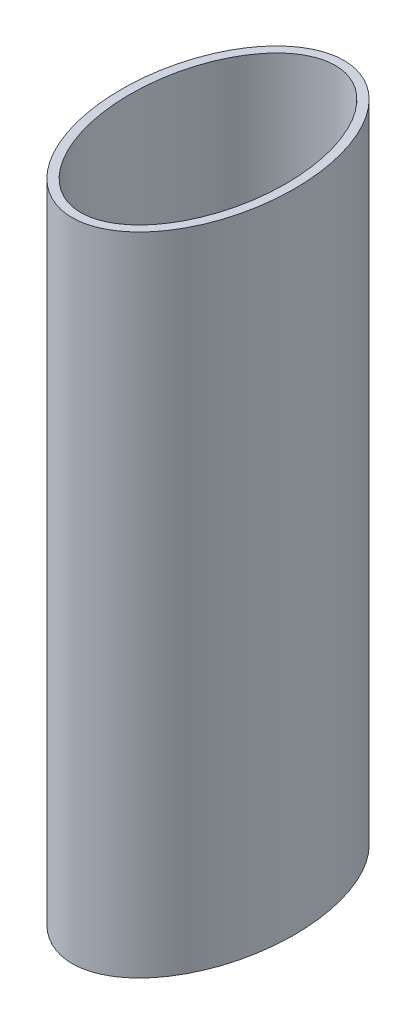
ISO-10303-21;
HEADER;
FILE_DESCRIPTION(('STEP AP214'),'2;1');
FILE_NAME('part.step','',(''),(''),'','','');
FILE_SCHEMA(('AUTOMOTIVE_DESIGN { 1 0 10303 214 1 1 1 1 }'));
ENDSEC;
DATA;
#1=APPLICATION_CONTEXT('core data for automotive mechanical design processes');
#2=APPLICATION_PROTOCOL_DEFINITION('international standard','automotive_design',2000,#1);
#3=PRODUCT_CONTEXT('',#1,'mechanical');
#4=PRODUCT('Part','Part','',(#3));
#5=PRODUCT_RELATED_PRODUCT_CATEGORY('part','',(#4));
#6=PRODUCT_DEFINITION_FORMATION('','',#4);
#7=PRODUCT_DEFINITION_CONTEXT('part definition',#1,'design');
#8=PRODUCT_DEFINITION('design','',#6,#7);
#9=PRODUCT_DEFINITION_SHAPE('','',#8);
#10=(LENGTH_UNIT() NAMED_UNIT(*) SI_UNIT(.MILLI.,.METRE.));
#11=(NAMED_UNIT(*) PLANE_ANGLE_UNIT() SI_UNIT($,.RADIAN.));
#12=(NAMED_UNIT(*) SI_UNIT($,.STERADIAN.) SOLID_ANGLE_UNIT());
#13=UNCERTAINTY_MEASURE_WITH_UNIT(LENGTH_MEASURE(1.E-05),#10,'distance_accuracy_value','');
#14=(GEOMETRIC_REPRESENTATION_CONTEXT(3) GLOBAL_UNCERTAINTY_ASSIGNED_CONTEXT((#13)) GLOBAL_UNIT_ASSIGNED_CONTEXT((#10,
#11,#12)) REPRESENTATION_CONTEXT('',''));
#15=CARTESIAN_POINT('',(0.,0.,0.));
#16=DIRECTION('',(0.,0.,1.));
#17=DIRECTION('',(1.,0.,0.));
#18=AXIS2_PLACEMENT_3D('',#15,#16,#17);
#19=CARTESIAN_POINT('',(0.,190.,0.));
#20=DIRECTION('',(0.,1.,0.));
#21=DIRECTION('',(0.,0.,-1.));
#22=AXIS2_PLACEMENT_3D('',#19,#20,#21);
#23=ELLIPSE('',#22,40.005,25.4);
#24=DIRECTION('',(0.,-1.,0.));
#25=VECTOR('',#24,1.);
#26=SURFACE_OF_LINEAR_EXTRUSION('',#23,#25);
#27=CARTESIAN_POINT('',(0.,190.,-40.005));
#28=VERTEX_POINT('',#27);
#29=EDGE_CURVE('E10',#28,#28,#23,.T.);
#30=ORIENTED_EDGE('',*,*,#29,.F.);
#31=EDGE_LOOP('',(#30));
#32=FACE_BOUND('',#31,.T.);
#33=CARTESIAN_POINT('',(0.,0.,0.));
#34=DIRECTION('',(0.,1.,0.));
#35=DIRECTION('',(0.,0.,-1.));
#36=AXIS2_PLACEMENT_3D('',#33,#34,#35);
#37=ELLIPSE('',#36,40.005,25.4);
#38=CARTESIAN_POINT('',(0.,0.,-40.005));
#39=VERTEX_POINT('',#38);
#40=EDGE_CURVE('E45',#39,#39,#37,.T.);
#41=ORIENTED_EDGE('',*,*,#40,.T.);
#42=EDGE_LOOP('',(#41));
#43=FACE_BOUND('',#42,.T.);
#44=ADVANCED_FACE('F41',(#32,#43),#26,.F.);
#45=CARTESIAN_POINT('',(0.,190.,0.));
#46=DIRECTION('',(0.,1.,0.));
#47=DIRECTION('',(0.,0.,1.));
#48=AXIS2_PLACEMENT_3D('',#45,#46,#47);
#49=PLANE('',#48);
#50=CARTESIAN_POINT('',(0.,190.,37.465));
#51=CARTESIAN_POINT('',(0.414448423922946,190.,37.465004374444));
#52=CARTESIAN_POINT('',(0.828866331709746,190.,37.4459979145985));
#53=CARTESIAN_POINT('',(1.65441120322675,190.,37.3704664108997));
#54=CARTESIAN_POINT('',(2.06553696197769,190.,37.313928212918));
#55=CARTESIAN_POINT('',(2.881701454367,190.,37.1646315351249));
#56=CARTESIAN_POINT('',(3.28673103265663,190.,37.0718233173257));
#57=CARTESIAN_POINT('',(4.08737543968349,190.,36.8521521220896));
#58=CARTESIAN_POINT('',(4.4829907663271,190.,36.7252909500424));
#59=CARTESIAN_POINT('',(5.25963497488405,190.,36.4412513746079));
#60=CARTESIAN_POINT('',(5.64075341664919,190.,36.2843166071428));
#61=CARTESIAN_POINT('',(6.39007899207038,190.,35.9422960226937));
#62=CARTESIAN_POINT('',(6.7582862646886,190.,35.757210508809));
#63=CARTESIAN_POINT('',(7.48076319999814,190.,35.3616960365381));
#64=CARTESIAN_POINT('',(7.83503337049581,190.,35.151268002658));
#65=CARTESIAN_POINT('',(8.52911210488282,190.,34.707720352644));
#66=CARTESIAN_POINT('',(8.86891701747657,190.,34.4745950555488));
#67=CARTESIAN_POINT('',(9.74497237099162,190.,33.8336177084517));
#68=CARTESIAN_POINT('',(10.26890538211,190.,33.4088380573749));
#69=CARTESIAN_POINT('',(11.2774377166251,190.,32.5148587871108));
#70=CARTESIAN_POINT('',(11.7620161880654,190.,32.0456359012782));
#71=CARTESIAN_POINT('',(12.6939424221609,190.,31.0696024160194));
#72=CARTESIAN_POINT('',(13.1411992344611,190.,30.5627053766742));
#73=CARTESIAN_POINT('',(13.998788022835,190.,29.5187800009299));
#74=CARTESIAN_POINT('',(14.4091214563378,190.,28.9817528551776));
#75=CARTESIAN_POINT('',(15.2121337585992,190.,27.8583142166302));
#76=CARTESIAN_POINT('',(15.603220546596,190.,27.2707687546045));
#77=CARTESIAN_POINT('',(16.3493031227568,190.,26.0728966004249));
#78=CARTESIAN_POINT('',(16.7042813078605,190.,25.4625589933579));
#79=CARTESIAN_POINT('',(17.3798794874783,190.,24.2230963435948));
#80=CARTESIAN_POINT('',(17.7004941240504,190.,23.5939683906172));
#81=CARTESIAN_POINT('',(18.3093794098373,190.,22.3193740940405));
#82=CARTESIAN_POINT('',(18.5976107371562,190.,21.6738890290808));
#83=CARTESIAN_POINT('',(19.1427540602479,190.,20.3700269705304));
#84=CARTESIAN_POINT('',(19.3996729942574,190.,19.71165287057));
#85=CARTESIAN_POINT('',(19.8836101430196,190.,18.3839894586006));
#86=CARTESIAN_POINT('',(20.1106256930594,190.,17.7146991798068));
#87=CARTESIAN_POINT('',(20.6364124435819,190.,16.0485512847703));
#88=CARTESIAN_POINT('',(20.9183952065905,190.,15.0463634268187));
#89=CARTESIAN_POINT('',(21.423099473597,190.,13.026894998963));
#90=CARTESIAN_POINT('',(21.6457980291103,190.,12.0096087449811));
#91=CARTESIAN_POINT('',(22.0341449624228,190.,9.96405647004885));
#92=CARTESIAN_POINT('',(22.1997834997028,190.,8.93578858671065));
#93=CARTESIAN_POINT('',(22.4758567387561,190.,6.87011313821167));
#94=CARTESIAN_POINT('',(22.5861964837205,190.,5.83269294350333));
#95=CARTESIAN_POINT('',(22.7523221007236,190.,3.7537238199755));
#96=CARTESIAN_POINT('',(22.8081191141986,190.,2.71217577801398));
#97=CARTESIAN_POINT('',(22.8657414016158,190.,0.627646505842776));
#98=CARTESIAN_POINT('',(22.8675692548732,190.,-0.415334653492289));
#99=CARTESIAN_POINT('',(22.8167077682517,190.,-2.52365950174605));
#100=CARTESIAN_POINT('',(22.7627805690017,190.,-3.58897366721971));
#101=CARTESIAN_POINT('',(22.5979474993928,190.,-5.71529343174462));
#102=CARTESIAN_POINT('',(22.4870367521909,190.,-6.77629865418738));
#103=CARTESIAN_POINT('',(22.207041302917,190.,-8.89099386651914));
#104=CARTESIAN_POINT('',(22.0379375729495,190.,-9.94468134854904));
#105=CARTESIAN_POINT('',(21.6403245953017,190.,-12.0378356156514));
#106=CARTESIAN_POINT('',(21.4119803637066,190.,-13.077333591044));
#107=CARTESIAN_POINT('',(20.8932742551138,190.,-15.1405014945456));
#108=CARTESIAN_POINT('',(20.6029294835669,190.,-16.1641757049377));
#109=CARTESIAN_POINT('',(19.9571379319012,190.,-18.1901922925111));
#110=CARTESIAN_POINT('',(19.601735165809,190.,-19.1925485833458));
#111=CARTESIAN_POINT('',(18.9047169430771,190.,-20.9593333117564));
#112=CARTESIAN_POINT('',(18.5762855149272,190.,-21.7289693466785));
#113=CARTESIAN_POINT('',(17.8740926402127,190.,-23.2472331064848));
#114=CARTESIAN_POINT('',(17.5003393078203,190.,-23.9958645624411));
#115=CARTESIAN_POINT('',(16.7048356421202,190.,-25.4668958748454));
#116=CARTESIAN_POINT('',(16.2831046715429,190.,-26.1893061594137));
#117=CARTESIAN_POINT('',(15.3884189590887,190.,-27.6017311264595));
#118=CARTESIAN_POINT('',(14.9154750760659,190.,-28.2917526321383));
#119=CARTESIAN_POINT('',(14.0293292182837,190.,-29.4780596331627));
#120=CARTESIAN_POINT('',(13.6271662296346,190.,-29.9825889155412));
#121=CARTESIAN_POINT('',(12.7887655147053,190.,-30.9626660726087));
#122=CARTESIAN_POINT('',(12.3525263860799,190.,-31.4382127531331));
#123=CARTESIAN_POINT('',(11.4451695888148,190.,-32.3538331184007));
#124=CARTESIAN_POINT('',(10.9741003948412,190.,-32.7939543876123));
#125=CARTESIAN_POINT('',(10.2406077927452,190.,-33.4223979506941));
#126=CARTESIAN_POINT('',(9.9916610970022,190.,-33.6265662291246));
#127=CARTESIAN_POINT('',(9.48465150510137,190.,-34.0234024132406));
#128=CARTESIAN_POINT('',(9.22658652109741,190.,-34.2160676575152));
#129=CARTESIAN_POINT('',(8.59470118777803,190.,-34.6644668848235));
#130=CARTESIAN_POINT('',(8.21645475536548,190.,-34.914016563098));
#131=CARTESIAN_POINT('',(7.44270136811752,190.,-35.3845764602448));
#132=CARTESIAN_POINT('',(7.04719948564054,190.,-35.6055949914187));
#133=CARTESIAN_POINT('',(6.2400428497783,190.,-36.0154249145427));
#134=CARTESIAN_POINT('',(5.82839684876282,190.,-36.2042534690006));
#135=CARTESIAN_POINT('',(4.99036329002692,190.,-36.5461173794692));
#136=CARTESIAN_POINT('',(4.56397556846282,190.,-36.6991523375129));
#137=CARTESIAN_POINT('',(3.84024272163277,190.,-36.9223180195639));
#138=CARTESIAN_POINT('',(3.54618094190691,190.,-37.0032074452688));
#139=CARTESIAN_POINT('',(2.95347737733211,190.,-37.1461823876781));
#140=CARTESIAN_POINT('',(2.65483541789965,190.,-37.2082671857222));
#141=CARTESIAN_POINT('',(2.05413851194401,190.,-37.3128234717382));
#142=CARTESIAN_POINT('',(1.75208364028681,190.,-37.3552953890878));
#143=CARTESIAN_POINT('',(1.14604035389511,190.,-37.4200325376793));
#144=CARTESIAN_POINT('',(0.842053574516957,190.,-37.4423130290124));
#145=CARTESIAN_POINT('',(0.233254642842897,190.,-37.4664088901139));
#146=CARTESIAN_POINT('',(-0.0715575345055395,190.,-37.4682236315798));
#147=CARTESIAN_POINT('',(-0.680544551616603,190.,-37.4513677093011));
#148=CARTESIAN_POINT('',(-0.984719495643383,190.,-37.4327007103388));
#149=CARTESIAN_POINT('',(-1.67754010086559,190.,-37.3669326336051));
#150=CARTESIAN_POINT('',(-2.06557620813854,190.,-37.3132486590673));
#151=CARTESIAN_POINT('',(-2.83570183524243,190.,-37.1736800879456));
#152=CARTESIAN_POINT('',(-3.21779216416761,190.,-37.0877999132033));
#153=CARTESIAN_POINT('',(-3.97397608615159,190.,-36.8855715959796));
#154=CARTESIAN_POINT('',(-4.34806610148783,190.,-36.7692101182534));
#155=CARTESIAN_POINT('',(-5.08624424501896,190.,-36.5082019411734));
#156=CARTESIAN_POINT('',(-5.45033073117671,190.,-36.3635506294247));
#157=CARTESIAN_POINT('',(-6.28679299401831,190.,-35.9956696633618));
#158=CARTESIAN_POINT('',(-6.75473854023137,190.,-35.7623292678933));
#159=CARTESIAN_POINT('',(-7.66815696156987,190.,-35.2552196202386));
#160=CARTESIAN_POINT('',(-8.11362314253201,190.,-34.9814384193356));
#161=CARTESIAN_POINT('',(-8.98164447252019,190.,-34.3984363191736));
#162=CARTESIAN_POINT('',(-9.40416240669964,190.,-34.0891602460765));
#163=CARTESIAN_POINT('',(-10.2252246475691,190.,-33.4404302384597));
#164=CARTESIAN_POINT('',(-10.6237679348968,190.,-33.1009750222912));
#165=CARTESIAN_POINT('',(-11.5851437934177,190.,-32.2248099065284));
#166=CARTESIAN_POINT('',(-12.1337068513157,190.,-31.6724001661057));
#167=CARTESIAN_POINT('',(-13.1805479747833,190.,-30.5218274840967));
#168=CARTESIAN_POINT('',(-13.6788017150159,190.,-29.9236426529349));
#169=CARTESIAN_POINT('',(-14.6281936981753,190.,-28.6897524957137));
#170=CARTESIAN_POINT('',(-15.0792610951173,190.,-28.0539929321682));
#171=CARTESIAN_POINT('',(-15.9361505210185,190.,-26.752882581985));
#172=CARTESIAN_POINT('',(-16.3419741467484,190.,-26.0875328408218));
#173=CARTESIAN_POINT('',(-17.1305947790013,190.,-24.6982902533005));
#174=CARTESIAN_POINT('',(-17.51117054293,190.,-23.9731410406937));
#175=CARTESIAN_POINT('',(-18.2281879311786,190.,-22.5010166283179));
#176=CARTESIAN_POINT('',(-18.5646083759209,190.,-21.7540311630724));
#177=CARTESIAN_POINT('',(-19.195553584587,190.,-20.2424960194583));
#178=CARTESIAN_POINT('',(-19.4900716260775,190.,-19.4779435456024));
#179=CARTESIAN_POINT('',(-20.0396244648011,190.,-17.9334901291138));
#180=CARTESIAN_POINT('',(-20.2945971559002,190.,-17.1535671691097));
#181=CARTESIAN_POINT('',(-20.7661914485948,190.,-15.5824313391415));
#182=CARTESIAN_POINT('',(-20.9828215168595,190.,-14.7912210034142));
#183=CARTESIAN_POINT('',(-21.3792382359049,190.,-13.1996094447536));
#184=CARTESIAN_POINT('',(-21.5590221500394,190.,-12.3992075438013));
#185=CARTESIAN_POINT('',(-21.93955567918,190.,-10.5099420003362));
#186=CARTESIAN_POINT('',(-22.1256440258697,190.,-9.4181031105704));
#187=CARTESIAN_POINT('',(-22.4349686373232,190.,-7.22531890450744));
#188=CARTESIAN_POINT('',(-22.5581864435934,190.,-6.12437101014905));
#189=CARTESIAN_POINT('',(-22.7430906870273,190.,-3.91710499474451));
#190=CARTESIAN_POINT('',(-22.8047644454852,190.,-2.81078581430999));
#191=CARTESIAN_POINT('',(-22.8672250316276,190.,-0.59604790914873));
#192=CARTESIAN_POINT('',(-22.8679903637401,190.,0.51237141874729));
#193=CARTESIAN_POINT('',(-22.8085960100405,190.,2.72733941959448));
#194=CARTESIAN_POINT('',(-22.7484493305794,190.,3.83388844138088));
#195=CARTESIAN_POINT('',(-22.5666058288344,190.,6.04171739847547));
#196=CARTESIAN_POINT('',(-22.4449231678048,190.,7.14299848725612));
#197=CARTESIAN_POINT('',(-22.1710624462369,190.,9.10464291258354));
#198=CARTESIAN_POINT('',(-22.03078294744,190.,9.9666820773358));
#199=CARTESIAN_POINT('',(-21.7101245268493,190.,11.6832613812042));
#200=CARTESIAN_POINT('',(-21.5297478669701,190.,12.5378019404976));
#201=CARTESIAN_POINT('',(-21.1275449208434,190.,14.2372962390312));
#202=CARTESIAN_POINT('',(-20.9057096733578,190.,15.0822478636698));
#203=CARTESIAN_POINT('',(-20.419497277319,190.,16.7578494880102));
#204=CARTESIAN_POINT('',(-20.1552150007549,190.,17.5885269118316));
#205=CARTESIAN_POINT('',(-19.5817924747554,190.,19.2341558256183));
#206=CARTESIAN_POINT('',(-19.2726596051827,190.,20.0491098778123));
#207=CARTESIAN_POINT('',(-18.6072268087233,190.,21.6591696601523));
#208=CARTESIAN_POINT('',(-18.250950075229,190.,22.4542849232396));
#209=CARTESIAN_POINT('',(-17.5322748965853,190.,23.9298096629541));
#210=CARTESIAN_POINT('',(-17.175325710012,190.,24.6128688971508));
#211=CARTESIAN_POINT('',(-16.4199101924136,190.,25.9557258119332));
#212=CARTESIAN_POINT('',(-16.021445149624,190.,26.6155242134518));
#213=CARTESIAN_POINT('',(-15.1807485315982,190.,27.9061727052102));
#214=CARTESIAN_POINT('',(-14.7385437798872,190.,28.5370401942085));
#215=CARTESIAN_POINT('',(-13.8075690405828,190.,29.7634662259556));
#216=CARTESIAN_POINT('',(-13.3188117014029,190.,30.3590342886759));
#217=CARTESIAN_POINT('',(-12.4242559283785,190.,31.3587220526105));
#218=CARTESIAN_POINT('',(-12.0294497636026,190.,31.7726863258237));
#219=CARTESIAN_POINT('',(-11.2118012466599,190.,32.5721154052383));
#220=CARTESIAN_POINT('',(-10.7889586634387,190.,32.9575799765119));
#221=CARTESIAN_POINT('',(-9.91516259481808,190.,33.6944396677837));
#222=CARTESIAN_POINT('',(-9.46423738586834,190.,34.045868175824));
#223=CARTESIAN_POINT('',(-8.53402900870969,190.,34.7089644783754));
#224=CARTESIAN_POINT('',(-8.05475530395452,190.,35.0206454332019));
#225=CARTESIAN_POINT('',(-7.19127878647486,190.,35.5258172411402));
#226=CARTESIAN_POINT('',(-6.81299460207545,190.,35.7294447722414));
#227=CARTESIAN_POINT('',(-6.04191360868823,190.,36.1072448072435));
#228=CARTESIAN_POINT('',(-5.64911705679518,190.,36.281417832643));
#229=CARTESIAN_POINT('',(-4.85137251879736,190.,36.5967864043364));
#230=CARTESIAN_POINT('',(-4.44645112131786,190.,36.7380488868676));
#231=CARTESIAN_POINT('',(-3.62603162455497,190.,36.9850139342775));
#232=CARTESIAN_POINT('',(-3.21053774247644,190.,37.0907304459479));
#233=CARTESIAN_POINT('',(-2.33239054037115,190.,37.2722420752423));
#234=CARTESIAN_POINT('',(-1.86895905296282,190.,37.3443171514177));
#235=CARTESIAN_POINT('',(-0.937006113473176,190.,37.4406989141707));
#236=CARTESIAN_POINT('',(-0.468483560657631,190.,37.4649950552228));
#237=CARTESIAN_POINT('',(0.,190.,37.465));
#238=B_SPLINE_CURVE_WITH_KNOTS('',3,(#50,#51,#52,#53,#54,#55,#56,#57,#58,#59,#60,#61,#62,#63,
#64,#65,#66,#67,#68,#69,#70,#71,#72,#73,#74,#75,#76,#77,#78,#79,#80,#81,#82,#83,#84,#85,#86,#87,
#88,#89,#90,#91,#92,#93,#94,#95,#96,#97,#98,#99,#100,#101,#102,#103,#104,#105,#106,#107,#108,
#109,#110,#111,#112,#113,#114,#115,#116,#117,#118,#119,#120,#121,#122,#123,#124,#125,#126,#127,
#128,#129,#130,#131,#132,#133,#134,#135,#136,#137,#138,#139,#140,#141,#142,#143,#144,#145,#146,
#147,#148,#149,#150,#151,#152,#153,#154,#155,#156,#157,#158,#159,#160,#161,#162,#163,#164,#165,
#166,#167,#168,#169,#170,#171,#172,#173,#174,#175,#176,#177,#178,#179,#180,#181,#182,#183,#184,
#185,#186,#187,#188,#189,#190,#191,#192,#193,#194,#195,#196,#197,#198,#199,#200,#201,#202,#203,
#204,#205,#206,#207,#208,#209,#210,#211,#212,#213,#214,#215,#216,#217,#218,#219,#220,#221,#222,
#223,#224,#225,#226,#227,#228,#229,#230,#231,#232,#233,#234,#235,#236,#237),.UNSPECIFIED.,.T.,
.F.,(4,2,2,2,2,2,2,2,2,2,2,2,2,2,2,2,2,2,2,2,2,2,2,2,2,2,2,2,2,2,2,2,2,2,2,2,2,2,2,2,2,2,2,2,2,
2,2,2,2,2,2,2,2,2,2,2,2,2,2,2,2,2,2,2,2,2,2,2,2,2,2,2,2,2,2,2,2,2,2,2,2,2,2,2,2,2,2,2,2,2,2,2,2,
4),(0.,1.24286321869788,2.48616226640074,3.73117229795968,4.97611633569838,6.21137127146488,
7.44661290817043,8.6818094963714,9.91731604407071,11.9375925556586,13.9589326179489,
15.9850628341165,18.0111130403286,20.1270937730055,22.244101158533,24.3614381477523,
26.4813189738299,28.6007292169376,30.7203281947017,33.8415912060727,36.9640606845087,
40.0870683919439,43.2154205811419,46.3431336086483,49.4706971550304,52.6692207198895,
55.8680180707236,59.0678623571735,62.2588873400565,65.4490330796033,68.6370284964655,
71.1460629655843,73.6546488930279,76.1622259775119,78.6692724088733,80.6035140729671,
82.537835379445,84.4695135140432,85.435114825965,86.4009386863051,87.7592182500463,
89.1171011934301,90.4742578839582,91.8314296631636,92.7458315802822,93.6602684388768,
94.5746852770849,95.488410447948,96.4021636702737,97.3157534220854,98.489480719552,
99.6630468757633,100.837127314612,102.0113993362,103.577728649209,105.144521681974,
106.713784020641,108.283113034657,110.614993656231,112.947996432773,115.28445319009,
117.620827461632,120.076042396943,122.532430732072,124.989212704089,127.449814822306,
129.909872920207,132.370113665957,135.69086924269,139.012599217387,142.335013361381,
145.658600034039,148.981477181244,152.303589983616,154.922847139415,157.541956578188,
160.161632791345,162.77553330896,165.389004213623,168.001194115008,170.311989969859,
172.622714142146,174.932029938603,177.240720070394,178.955654815907,180.67060369635,
182.383852868155,184.096533306492,185.384241463515,186.671926818992,187.956969850457,
189.24150809339,190.646103892453,192.05100967203),.UNSPECIFIED.);
#239=CARTESIAN_POINT('',(0.,190.,37.465));
#240=VERTEX_POINT('',#239);
#241=EDGE_CURVE('E53',#240,#240,#238,.T.);
#242=ORIENTED_EDGE('',*,*,#241,.F.);
#243=EDGE_LOOP('',(#242));
#244=FACE_BOUND('',#243,.T.);
#245=ORIENTED_EDGE('',*,*,#29,.T.);
#246=EDGE_LOOP('',(#245));
#247=FACE_BOUND('',#246,.T.);
#248=ADVANCED_FACE('F85',(#244,#247),#49,.T.);
#249=CARTESIAN_POINT('',(0.,0.,0.));
#250=DIRECTION('',(0.,1.,0.));
#251=DIRECTION('',(0.,0.,1.));
#252=AXIS2_PLACEMENT_3D('',#249,#250,#251);
#253=PLANE('',#252);
#254=ORIENTED_EDGE('',*,*,#40,.F.);
#255=EDGE_LOOP('',(#254));
#256=FACE_BOUND('',#255,.T.);
#257=ADVANCED_FACE('F78',(#256),#253,.F.);
#258=CARTESIAN_POINT('',(0.,190.,0.));
#259=DIRECTION('',(0.,1.,0.));
#260=DIRECTION('',(0.,0.,-1.));
#261=AXIS2_PLACEMENT_3D('',#258,#259,#260);
#262=ELLIPSE('',#261,40.005,25.4);
#263=DIRECTION('',(0.,-1.,0.));
#264=VECTOR('',#263,1.);
#265=SURFACE_OF_LINEAR_EXTRUSION('',#262,#264);
#266=OFFSET_SURFACE('',#265,2.54,.F.);
#267=ORIENTED_EDGE('',*,*,#241,.T.);
#268=EDGE_LOOP('',(#267));
#269=FACE_BOUND('',#268,.T.);
#270=CARTESIAN_POINT('',(0.,2.53999999999998,37.465));
#271=CARTESIAN_POINT('',(0.414448423922946,2.53999999999998,37.465004374444));
#272=CARTESIAN_POINT('',(0.828866331709746,2.54,37.4459979145985));
#273=CARTESIAN_POINT('',(1.65441120322675,2.54000000000001,37.3704664108997));
#274=CARTESIAN_POINT('',(2.06553696197769,2.54,37.313928212918));
#275=CARTESIAN_POINT('',(2.881701454367,2.54,37.1646315351249));
#276=CARTESIAN_POINT('',(3.28673103265663,2.54,37.0718233173257));
#277=CARTESIAN_POINT('',(4.08737543968349,2.54,36.8521521220896));
#278=CARTESIAN_POINT('',(4.4829907663271,2.53999999999999,36.7252909500424));
#279=CARTESIAN_POINT('',(5.25963497488405,2.53999999999999,36.4412513746079));
#280=CARTESIAN_POINT('',(5.64075341664919,2.54,36.2843166071428));
#281=CARTESIAN_POINT('',(6.39007899207038,2.54,35.9422960226937));
#282=CARTESIAN_POINT('',(6.7582862646886,2.54,35.757210508809));
#283=CARTESIAN_POINT('',(7.48076319999814,2.54,35.3616960365381));
#284=CARTESIAN_POINT('',(7.83503337049581,2.54,35.151268002658));
#285=CARTESIAN_POINT('',(8.52911210488282,2.54,34.707720352644));
#286=CARTESIAN_POINT('',(8.86891701747657,2.53999999999999,34.4745950555488));
#287=CARTESIAN_POINT('',(9.74497237099162,2.53999999999998,33.8336177084517));
#288=CARTESIAN_POINT('',(10.26890538211,2.54,33.4088380573749));
#289=CARTESIAN_POINT('',(11.2774377166251,2.54,32.5148587871108));
#290=CARTESIAN_POINT('',(11.7620161880654,2.54,32.0456359012782));
#291=CARTESIAN_POINT('',(12.6939424221609,2.54,31.0696024160194));
#292=CARTESIAN_POINT('',(13.1411992344611,2.54,30.5627053766742));
#293=CARTESIAN_POINT('',(13.998788022835,2.54,29.5187800009299));
#294=CARTESIAN_POINT('',(14.4091214563378,2.53999999999999,28.9817528551776));
#295=CARTESIAN_POINT('',(15.2121337585992,2.53999999999999,27.8583142166302));
#296=CARTESIAN_POINT('',(15.603220546596,2.54,27.2707687546045));
#297=CARTESIAN_POINT('',(16.3493031227568,2.54,26.0728966004249));
#298=CARTESIAN_POINT('',(16.7042813078605,2.54,25.4625589933579));
#299=CARTESIAN_POINT('',(17.3798794874783,2.54,24.2230963435948));
#300=CARTESIAN_POINT('',(17.7004941240504,2.54,23.5939683906172));
#301=CARTESIAN_POINT('',(18.3093794098373,2.54,22.3193740940405));
#302=CARTESIAN_POINT('',(18.5976107371562,2.54,21.6738890290808));
#303=CARTESIAN_POINT('',(19.1427540602479,2.54,20.3700269705304));
#304=CARTESIAN_POINT('',(19.3996729942574,2.54,19.71165287057));
#305=CARTESIAN_POINT('',(19.8836101430196,2.54,18.3839894586006));
#306=CARTESIAN_POINT('',(20.1106256930594,2.53999999999999,17.7146991798068));
#307=CARTESIAN_POINT('',(20.6364124435819,2.53999999999998,16.0485512847703));
#308=CARTESIAN_POINT('',(20.9183952065905,2.54,15.0463634268187));
#309=CARTESIAN_POINT('',(21.423099473597,2.54,13.026894998963));
#310=CARTESIAN_POINT('',(21.6457980291103,2.54,12.0096087449811));
#311=CARTESIAN_POINT('',(22.0341449624228,2.54,9.96405647004885));
#312=CARTESIAN_POINT('',(22.1997834997028,2.54,8.93578858671065));
#313=CARTESIAN_POINT('',(22.4758567387561,2.54,6.87011313821167));
#314=CARTESIAN_POINT('',(22.5861964837205,2.54,5.83269294350333));
#315=CARTESIAN_POINT('',(22.7523221007236,2.54,3.7537238199755));
#316=CARTESIAN_POINT('',(22.8081191141986,2.54,2.71217577801398));
#317=CARTESIAN_POINT('',(22.8657414016158,2.54,0.627646505842776));
#318=CARTESIAN_POINT('',(22.8675692548732,2.53999999999999,-0.415334653492289));
#319=CARTESIAN_POINT('',(22.8167077682517,2.53999999999999,-2.52365950174605));
#320=CARTESIAN_POINT('',(22.7627805690017,2.54,-3.58897366721971));
#321=CARTESIAN_POINT('',(22.5979474993928,2.54,-5.71529343174462));
#322=CARTESIAN_POINT('',(22.4870367521909,2.54,-6.77629865418738));
#323=CARTESIAN_POINT('',(22.207041302917,2.54,-8.89099386651914));
#324=CARTESIAN_POINT('',(22.0379375729495,2.54,-9.94468134854904));
#325=CARTESIAN_POINT('',(21.6403245953017,2.54,-12.0378356156514));
#326=CARTESIAN_POINT('',(21.4119803637066,2.54,-13.077333591044));
#327=CARTESIAN_POINT('',(20.8932742551138,2.54,-15.1405014945456));
#328=CARTESIAN_POINT('',(20.6029294835669,2.54,-16.1641757049377));
#329=CARTESIAN_POINT('',(19.9571379319012,2.54,-18.1901922925111));
#330=CARTESIAN_POINT('',(19.601735165809,2.53999999999998,-19.1925485833458));
#331=CARTESIAN_POINT('',(18.9047169430771,2.53999999999999,-20.9593333117564));
#332=CARTESIAN_POINT('',(18.5762855149272,2.54,-21.7289693466785));
#333=CARTESIAN_POINT('',(17.8740926402127,2.54,-23.2472331064848));
#334=CARTESIAN_POINT('',(17.5003393078203,2.54,-23.9958645624411));
#335=CARTESIAN_POINT('',(16.7048356421202,2.54,-25.4668958748454));
#336=CARTESIAN_POINT('',(16.2831046715429,2.54,-26.1893061594137));
#337=CARTESIAN_POINT('',(15.3884189590887,2.54,-27.6017311264595));
#338=CARTESIAN_POINT('',(14.9154750760659,2.53999999999998,-28.2917526321383));
#339=CARTESIAN_POINT('',(14.0293292182837,2.53999999999999,-29.4780596331627));
#340=CARTESIAN_POINT('',(13.6271662296346,2.54,-29.9825889155412));
#341=CARTESIAN_POINT('',(12.7887655147053,2.54,-30.9626660726087));
#342=CARTESIAN_POINT('',(12.3525263860799,2.54,-31.4382127531331));
#343=CARTESIAN_POINT('',(11.4451695888148,2.54,-32.3538331184007));
#344=CARTESIAN_POINT('',(10.9741003948412,2.54,-32.7939543876123));
#345=CARTESIAN_POINT('',(10.2406077927452,2.54,-33.4223979506941));
#346=CARTESIAN_POINT('',(9.9916610970022,2.54,-33.6265662291246));
#347=CARTESIAN_POINT('',(9.48465150510137,2.54,-34.0234024132406));
#348=CARTESIAN_POINT('',(9.22658652109741,2.53999999999999,-34.2160676575152));
#349=CARTESIAN_POINT('',(8.59470118777803,2.53999999999998,-34.6644668848235));
#350=CARTESIAN_POINT('',(8.21645475536548,2.54,-34.914016563098));
#351=CARTESIAN_POINT('',(7.44270136811752,2.54,-35.3845764602448));
#352=CARTESIAN_POINT('',(7.04719948564054,2.54,-35.6055949914187));
#353=CARTESIAN_POINT('',(6.2400428497783,2.54,-36.0154249145427));
#354=CARTESIAN_POINT('',(5.82839684876282,2.54,-36.2042534690006));
#355=CARTESIAN_POINT('',(4.99036329002692,2.54,-36.5461173794692));
#356=CARTESIAN_POINT('',(4.56397556846282,2.53999999999998,-36.6991523375129));
#357=CARTESIAN_POINT('',(3.84024272163277,2.53999999999999,-36.9223180195639));
#358=CARTESIAN_POINT('',(3.54618094190691,2.54,-37.0032074452688));
#359=CARTESIAN_POINT('',(2.95347737733211,2.54,-37.1461823876781));
#360=CARTESIAN_POINT('',(2.65483541789965,2.54,-37.2082671857222));
#361=CARTESIAN_POINT('',(2.05413851194401,2.54,-37.3128234717382));
#362=CARTESIAN_POINT('',(1.75208364028681,2.54,-37.3552953890878));
#363=CARTESIAN_POINT('',(1.14604035389511,2.54,-37.4200325376793));
#364=CARTESIAN_POINT('',(0.842053574516957,2.54,-37.4423130290124));
#365=CARTESIAN_POINT('',(0.233254642842897,2.54,-37.4664088901139));
#366=CARTESIAN_POINT('',(-0.0715575345055395,2.54,-37.4682236315798));
#367=CARTESIAN_POINT('',(-0.680544551616603,2.54,-37.4513677093011));
#368=CARTESIAN_POINT('',(-0.984719495643383,2.53999999999999,-37.4327007103388));
#369=CARTESIAN_POINT('',(-1.67754010086559,2.53999999999998,-37.3669326336051));
#370=CARTESIAN_POINT('',(-2.06557620813854,2.54,-37.3132486590673));
#371=CARTESIAN_POINT('',(-2.83570183524243,2.54,-37.1736800879456));
#372=CARTESIAN_POINT('',(-3.21779216416761,2.54,-37.0877999132033));
#373=CARTESIAN_POINT('',(-3.97397608615159,2.54,-36.8855715959796));
#374=CARTESIAN_POINT('',(-4.34806610148783,2.54,-36.7692101182534));
#375=CARTESIAN_POINT('',(-5.08624424501896,2.54,-36.5082019411734));
#376=CARTESIAN_POINT('',(-5.45033073117671,2.53999999999999,-36.3635506294247));
#377=CARTESIAN_POINT('',(-6.28679299401831,2.53999999999998,-35.9956696633618));
#378=CARTESIAN_POINT('',(-6.75473854023137,2.54,-35.7623292678933));
#379=CARTESIAN_POINT('',(-7.66815696156987,2.54,-35.2552196202386));
#380=CARTESIAN_POINT('',(-8.11362314253201,2.54,-34.9814384193356));
#381=CARTESIAN_POINT('',(-8.98164447252019,2.54,-34.3984363191736));
#382=CARTESIAN_POINT('',(-9.40416240669964,2.54,-34.0891602460765));
#383=CARTESIAN_POINT('',(-10.2252246475691,2.54,-33.4404302384597));
#384=CARTESIAN_POINT('',(-10.6237679348968,2.53999999999999,-33.1009750222912));
#385=CARTESIAN_POINT('',(-11.5851437934177,2.53999999999998,-32.2248099065284));
#386=CARTESIAN_POINT('',(-12.1337068513157,2.54,-31.6724001661057));
#387=CARTESIAN_POINT('',(-13.1805479747833,2.54,-30.5218274840967));
#388=CARTESIAN_POINT('',(-13.6788017150159,2.54,-29.9236426529349));
#389=CARTESIAN_POINT('',(-14.6281936981753,2.54,-28.6897524957137));
#390=CARTESIAN_POINT('',(-15.0792610951173,2.54,-28.0539929321682));
#391=CARTESIAN_POINT('',(-15.9361505210185,2.54,-26.752882581985));
#392=CARTESIAN_POINT('',(-16.3419741467484,2.53999999999999,-26.0875328408218));
#393=CARTESIAN_POINT('',(-17.1305947790013,2.53999999999999,-24.6982902533005));
#394=CARTESIAN_POINT('',(-17.51117054293,2.54,-23.9731410406937));
#395=CARTESIAN_POINT('',(-18.2281879311786,2.54,-22.5010166283179));
#396=CARTESIAN_POINT('',(-18.5646083759209,2.54,-21.7540311630724));
#397=CARTESIAN_POINT('',(-19.195553584587,2.54,-20.2424960194583));
#398=CARTESIAN_POINT('',(-19.4900716260775,2.54,-19.4779435456024));
#399=CARTESIAN_POINT('',(-20.0396244648011,2.54,-17.9334901291138));
#400=CARTESIAN_POINT('',(-20.2945971559002,2.54,-17.1535671691097));
#401=CARTESIAN_POINT('',(-20.7661914485948,2.54,-15.5824313391415));
#402=CARTESIAN_POINT('',(-20.9828215168595,2.54,-14.7912210034142));
#403=CARTESIAN_POINT('',(-21.3792382359049,2.54,-13.1996094447536));
#404=CARTESIAN_POINT('',(-21.5590221500394,2.53999999999999,-12.3992075438013));
#405=CARTESIAN_POINT('',(-21.93955567918,2.53999999999998,-10.5099420003362));
#406=CARTESIAN_POINT('',(-22.1256440258697,2.54,-9.4181031105704));
#407=CARTESIAN_POINT('',(-22.4349686373232,2.54,-7.22531890450744));
#408=CARTESIAN_POINT('',(-22.5581864435934,2.54,-6.12437101014905));
#409=CARTESIAN_POINT('',(-22.7430906870273,2.54,-3.91710499474451));
#410=CARTESIAN_POINT('',(-22.8047644454852,2.54,-2.81078581430999));
#411=CARTESIAN_POINT('',(-22.8672250316276,2.54,-0.59604790914873));
#412=CARTESIAN_POINT('',(-22.8679903637401,2.54,0.51237141874729));
#413=CARTESIAN_POINT('',(-22.8085960100405,2.54,2.72733941959448));
#414=CARTESIAN_POINT('',(-22.7484493305794,2.54,3.83388844138088));
#415=CARTESIAN_POINT('',(-22.5666058288344,2.54,6.04171739847547));
#416=CARTESIAN_POINT('',(-22.4449231678048,2.53999999999998,7.14299848725612));
#417=CARTESIAN_POINT('',(-22.1710624462369,2.53999999999999,9.10464291258354));
#418=CARTESIAN_POINT('',(-22.03078294744,2.54,9.9666820773358));
#419=CARTESIAN_POINT('',(-21.7101245268493,2.54,11.6832613812042));
#420=CARTESIAN_POINT('',(-21.5297478669701,2.54,12.5378019404976));
#421=CARTESIAN_POINT('',(-21.1275449208434,2.54,14.2372962390312));
#422=CARTESIAN_POINT('',(-20.9057096733578,2.54,15.0822478636698));
#423=CARTESIAN_POINT('',(-20.419497277319,2.54,16.7578494880102));
#424=CARTESIAN_POINT('',(-20.1552150007549,2.54,17.5885269118316));
#425=CARTESIAN_POINT('',(-19.5817924747554,2.54,19.2341558256183));
#426=CARTESIAN_POINT('',(-19.2726596051827,2.54,20.0491098778123));
#427=CARTESIAN_POINT('',(-18.6072268087233,2.54,21.6591696601523));
#428=CARTESIAN_POINT('',(-18.250950075229,2.53999999999999,22.4542849232396));
#429=CARTESIAN_POINT('',(-17.5322748965853,2.53999999999999,23.9298096629541));
#430=CARTESIAN_POINT('',(-17.175325710012,2.54,24.6128688971508));
#431=CARTESIAN_POINT('',(-16.4199101924136,2.54,25.9557258119332));
#432=CARTESIAN_POINT('',(-16.021445149624,2.54,26.6155242134518));
#433=CARTESIAN_POINT('',(-15.1807485315982,2.54,27.9061727052102));
#434=CARTESIAN_POINT('',(-14.7385437798872,2.54,28.5370401942085));
#435=CARTESIAN_POINT('',(-13.8075690405828,2.54,29.7634662259556));
#436=CARTESIAN_POINT('',(-13.3188117014029,2.53999999999998,30.3590342886759));
#437=CARTESIAN_POINT('',(-12.4242559283785,2.53999999999999,31.3587220526105));
#438=CARTESIAN_POINT('',(-12.0294497636026,2.54,31.7726863258237));
#439=CARTESIAN_POINT('',(-11.2118012466599,2.54,32.5721154052383));
#440=CARTESIAN_POINT('',(-10.7889586634387,2.54,32.9575799765119));
#441=CARTESIAN_POINT('',(-9.91516259481808,2.54,33.6944396677837));
#442=CARTESIAN_POINT('',(-9.46423738586834,2.54,34.045868175824));
#443=CARTESIAN_POINT('',(-8.53402900870969,2.54,34.7089644783754));
#444=CARTESIAN_POINT('',(-8.05475530395452,2.53999999999998,35.0206454332019));
#445=CARTESIAN_POINT('',(-7.19127878647486,2.53999999999999,35.5258172411402));
#446=CARTESIAN_POINT('',(-6.81299460207545,2.54,35.7294447722414));
#447=CARTESIAN_POINT('',(-6.04191360868823,2.54,36.1072448072435));
#448=CARTESIAN_POINT('',(-5.64911705679518,2.54,36.281417832643));
#449=CARTESIAN_POINT('',(-4.85137251879736,2.54,36.5967864043364));
#450=CARTESIAN_POINT('',(-4.44645112131786,2.54,36.7380488868676));
#451=CARTESIAN_POINT('',(-3.62603162455497,2.54,36.9850139342775));
#452=CARTESIAN_POINT('',(-3.21053774247644,2.53999999999999,37.0907304459479));
#453=CARTESIAN_POINT('',(-2.33239054037115,2.53999999999999,37.2722420752423));
#454=CARTESIAN_POINT('',(-1.86895905296282,2.54,37.3443171514177));
#455=CARTESIAN_POINT('',(-0.937006113473176,2.54,37.4406989141707));
#456=CARTESIAN_POINT('',(-0.468483560657631,2.53999999999998,37.4649950552228));
#457=CARTESIAN_POINT('',(0.,2.53999999999998,37.465));
#458=B_SPLINE_CURVE_WITH_KNOTS('',3,(#270,#271,#272,#273,#274,#275,#276,#277,#278,#279,#280,
#281,#282,#283,#284,#285,#286,#287,#288,#289,#290,#291,#292,#293,#294,#295,#296,#297,#298,#299,
#300,#301,#302,#303,#304,#305,#306,#307,#308,#309,#310,#311,#312,#313,#314,#315,#316,#317,#318,
#319,#320,#321,#322,#323,#324,#325,#326,#327,#328,#329,#330,#331,#332,#333,#334,#335,#336,#337,
#338,#339,#340,#341,#342,#343,#344,#345,#346,#347,#348,#349,#350,#351,#352,#353,#354,#355,#356,
#357,#358,#359,#360,#361,#362,#363,#364,#365,#366,#367,#368,#369,#370,#371,#372,#373,#374,#375,
#376,#377,#378,#379,#380,#381,#382,#383,#384,#385,#386,#387,#388,#389,#390,#391,#392,#393,#394,
#395,#396,#397,#398,#399,#400,#401,#402,#403,#404,#405,#406,#407,#408,#409,#410,#411,#412,#413,
#414,#415,#416,#417,#418,#419,#420,#421,#422,#423,#424,#425,#426,#427,#428,#429,#430,#431,#432,
#433,#434,#435,#436,#437,#438,#439,#440,#441,#442,#443,#444,#445,#446,#447,#448,#449,#450,#451,
#452,#453,#454,#455,#456,#457),.UNSPECIFIED.,.T.,.F.,(4,2,2,2,2,2,2,2,2,2,2,2,2,2,2,2,2,2,2,2,2,
2,2,2,2,2,2,2,2,2,2,2,2,2,2,2,2,2,2,2,2,2,2,2,2,2,2,2,2,2,2,2,2,2,2,2,2,2,2,2,2,2,2,2,2,2,2,2,2,
2,2,2,2,2,2,2,2,2,2,2,2,2,2,2,2,2,2,2,2,2,2,2,2,4),(0.,1.24286321869788,2.48616226640074,
3.73117229795968,4.97611633569838,6.21137127146488,7.44661290817043,8.6818094963714,
9.91731604407071,11.9375925556586,13.9589326179489,15.9850628341165,18.0111130403286,
20.1270937730055,22.244101158533,24.3614381477523,26.4813189738299,28.6007292169376,
30.7203281947017,33.8415912060727,36.9640606845087,40.0870683919439,43.2154205811419,
46.3431336086483,49.4706971550304,52.6692207198895,55.8680180707236,59.0678623571735,
62.2588873400565,65.4490330796033,68.6370284964655,71.1460629655843,73.6546488930279,
76.1622259775119,78.6692724088733,80.6035140729671,82.537835379445,84.4695135140432,
85.435114825965,86.4009386863051,87.7592182500463,89.1171011934301,90.4742578839582,
91.8314296631636,92.7458315802822,93.6602684388768,94.5746852770849,95.488410447948,
96.4021636702737,97.3157534220854,98.489480719552,99.6630468757633,100.837127314612,
102.0113993362,103.577728649209,105.144521681974,106.713784020641,108.283113034657,
110.614993656231,112.947996432773,115.28445319009,117.620827461632,120.076042396943,
122.532430732072,124.989212704089,127.449814822306,129.909872920207,132.370113665957,
135.69086924269,139.012599217387,142.335013361381,145.658600034039,148.981477181244,
152.303589983616,154.922847139415,157.541956578188,160.161632791345,162.77553330896,
165.389004213623,168.001194115008,170.311989969859,172.622714142146,174.932029938603,
177.240720070394,178.955654815907,180.67060369635,182.383852868155,184.096533306492,
185.384241463515,186.671926818992,187.956969850457,189.24150809339,190.646103892453,
192.05100967203),.UNSPECIFIED.);
#459=CARTESIAN_POINT('',(0.,2.53999999999998,37.465));
#460=VERTEX_POINT('',#459);
#461=EDGE_CURVE('E64',#460,#460,#458,.T.);
#462=ORIENTED_EDGE('',*,*,#461,.F.);
#463=EDGE_LOOP('',(#462));
#464=FACE_BOUND('',#463,.T.);
#465=ADVANCED_FACE('F70',(#269,#464),#266,.T.);
#466=CARTESIAN_POINT('',(0.,2.54,0.));
#467=DIRECTION('',(0.,1.,0.));
#468=DIRECTION('',(0.,0.,1.));
#469=AXIS2_PLACEMENT_3D('',#466,#467,#468);
#470=PLANE('',#469);
#471=ORIENTED_EDGE('',*,*,#461,.T.);
#472=EDGE_LOOP('',(#471));
#473=FACE_BOUND('',#472,.T.);
#474=ADVANCED_FACE('F77',(#473),#470,.T.);
#475=CLOSED_SHELL('',(#44,#248,#257,#465,#474));
#476=MANIFOLD_SOLID_BREP('B2',#475);
#477=ADVANCED_BREP_SHAPE_REPRESENTATION('',(#18,#476),#14);
#478=SHAPE_DEFINITION_REPRESENTATION(#9,#477);
ENDSEC;
END-ISO-10303-21;
